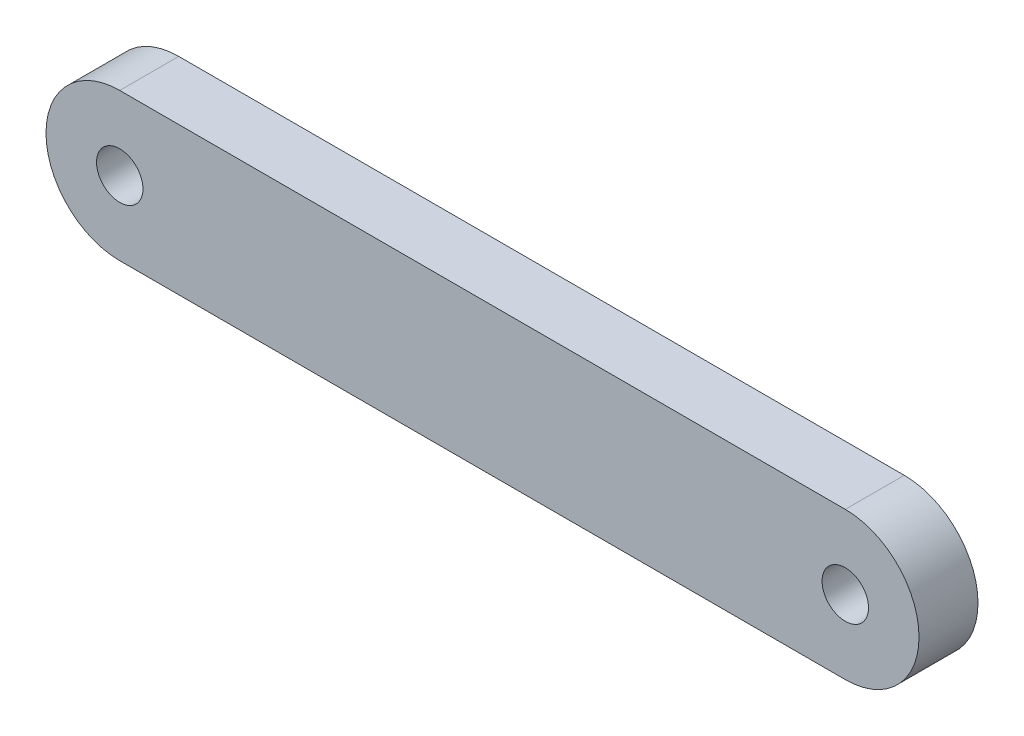
ISO-10303-21;
HEADER;
FILE_DESCRIPTION(('STEP AP214'),'2;1');
FILE_NAME('part.step','',(''),(''),'','','');
FILE_SCHEMA(('AUTOMOTIVE_DESIGN { 1 0 10303 214 1 1 1 1 }'));
ENDSEC;
DATA;
#1=APPLICATION_CONTEXT('core data for automotive mechanical design processes');
#2=APPLICATION_PROTOCOL_DEFINITION('international standard','automotive_design',2000,#1);
#3=PRODUCT_CONTEXT('',#1,'mechanical');
#4=PRODUCT('Part','Part','',(#3));
#5=PRODUCT_RELATED_PRODUCT_CATEGORY('part','',(#4));
#6=PRODUCT_DEFINITION_FORMATION('','',#4);
#7=PRODUCT_DEFINITION_CONTEXT('part definition',#1,'design');
#8=PRODUCT_DEFINITION('design','',#6,#7);
#9=PRODUCT_DEFINITION_SHAPE('','',#8);
#10=(LENGTH_UNIT() NAMED_UNIT(*) SI_UNIT(.MILLI.,.METRE.));
#11=(NAMED_UNIT(*) PLANE_ANGLE_UNIT() SI_UNIT($,.RADIAN.));
#12=(NAMED_UNIT(*) SI_UNIT($,.STERADIAN.) SOLID_ANGLE_UNIT());
#13=UNCERTAINTY_MEASURE_WITH_UNIT(LENGTH_MEASURE(1.E-05),#10,'distance_accuracy_value','');
#14=(GEOMETRIC_REPRESENTATION_CONTEXT(3) GLOBAL_UNCERTAINTY_ASSIGNED_CONTEXT((#13)) GLOBAL_UNIT_ASSIGNED_CONTEXT((#10,
#11,#12)) REPRESENTATION_CONTEXT('',''));
#15=CARTESIAN_POINT('',(0.,0.,0.));
#16=DIRECTION('',(0.,0.,1.));
#17=DIRECTION('',(1.,0.,0.));
#18=AXIS2_PLACEMENT_3D('',#15,#16,#17);
#19=CARTESIAN_POINT('',(0.,0.,5.08));
#20=DIRECTION('',(0.,0.,1.));
#21=DIRECTION('',(1.,0.,0.));
#22=AXIS2_PLACEMENT_3D('',#19,#20,#21);
#23=PLANE('',#22);
#24=CARTESIAN_POINT('',(0.,0.,5.08));
#25=DIRECTION('',(0.,0.,1.));
#26=DIRECTION('',(1.,0.,0.));
#27=AXIS2_PLACEMENT_3D('',#24,#25,#26);
#28=CIRCLE('',#27,2.);
#29=CARTESIAN_POINT('',(2.,0.,5.08));
#30=VERTEX_POINT('',#29);
#31=EDGE_CURVE('E100',#30,#30,#28,.T.);
#32=ORIENTED_EDGE('',*,*,#31,.F.);
#33=EDGE_LOOP('',(#32));
#34=FACE_BOUND('',#33,.T.);
#35=CARTESIAN_POINT('',(0.,0.,5.08));
#36=DIRECTION('',(0.,0.,1.));
#37=DIRECTION('',(1.,0.,0.));
#38=AXIS2_PLACEMENT_3D('',#35,#36,#37);
#39=CIRCLE('',#38,6.35);
#40=CARTESIAN_POINT('',(0.,6.35,5.08));
#41=VERTEX_POINT('',#40);
#42=CARTESIAN_POINT('',(0.,-6.35,5.08));
#43=VERTEX_POINT('',#42);
#44=EDGE_CURVE('E85',#41,#43,#39,.T.);
#45=ORIENTED_EDGE('',*,*,#44,.T.);
#46=DIRECTION('',(1.,0.,0.));
#47=VECTOR('',#46,1.);
#48=CARTESIAN_POINT('',(0.,-6.35,5.08));
#49=LINE('',#48,#47);
#50=CARTESIAN_POINT('',(62.484,-6.35,5.08));
#51=VERTEX_POINT('',#50);
#52=EDGE_CURVE('E80',#43,#51,#49,.T.);
#53=ORIENTED_EDGE('',*,*,#52,.T.);
#54=CARTESIAN_POINT('',(62.484,0.,5.08));
#55=DIRECTION('',(0.,0.,1.));
#56=DIRECTION('',(1.,0.,0.));
#57=AXIS2_PLACEMENT_3D('',#54,#55,#56);
#58=CIRCLE('',#57,6.35);
#59=CARTESIAN_POINT('',(62.484,6.35,5.08));
#60=VERTEX_POINT('',#59);
#61=EDGE_CURVE('E83',#51,#60,#58,.T.);
#62=ORIENTED_EDGE('',*,*,#61,.T.);
#63=DIRECTION('',(-1.,0.,0.));
#64=VECTOR('',#63,1.);
#65=CARTESIAN_POINT('',(0.,6.35,5.08));
#66=LINE('',#65,#64);
#67=EDGE_CURVE('E50',#60,#41,#66,.T.);
#68=ORIENTED_EDGE('',*,*,#67,.T.);
#69=EDGE_LOOP('',(#45,#53,#62,#68));
#70=FACE_BOUND('',#69,.T.);
#71=CARTESIAN_POINT('',(62.484,0.,5.08));
#72=DIRECTION('',(0.,0.,1.));
#73=DIRECTION('',(1.,0.,0.));
#74=AXIS2_PLACEMENT_3D('',#71,#72,#73);
#75=CIRCLE('',#74,2.);
#76=CARTESIAN_POINT('',(64.484,0.,5.08));
#77=VERTEX_POINT('',#76);
#78=EDGE_CURVE('E115',#77,#77,#75,.T.);
#79=ORIENTED_EDGE('',*,*,#78,.F.);
#80=EDGE_LOOP('',(#79));
#81=FACE_BOUND('',#80,.T.);
#82=ADVANCED_FACE('F33',(#34,#70,#81),#23,.T.);
#83=CARTESIAN_POINT('',(0.,0.,0.));
#84=DIRECTION('',(0.,0.,1.));
#85=DIRECTION('',(1.,0.,0.));
#86=AXIS2_PLACEMENT_3D('',#83,#84,#85);
#87=PLANE('',#86);
#88=CARTESIAN_POINT('',(0.,0.,0.));
#89=DIRECTION('',(0.,0.,1.));
#90=DIRECTION('',(1.,0.,0.));
#91=AXIS2_PLACEMENT_3D('',#88,#89,#90);
#92=CIRCLE('',#91,2.);
#93=CARTESIAN_POINT('',(2.,0.,0.));
#94=VERTEX_POINT('',#93);
#95=EDGE_CURVE('E112',#94,#94,#92,.T.);
#96=ORIENTED_EDGE('',*,*,#95,.T.);
#97=EDGE_LOOP('',(#96));
#98=FACE_BOUND('',#97,.T.);
#99=CARTESIAN_POINT('',(0.,0.,0.));
#100=DIRECTION('',(0.,0.,1.));
#101=DIRECTION('',(1.,0.,0.));
#102=AXIS2_PLACEMENT_3D('',#99,#100,#101);
#103=CIRCLE('',#102,6.35);
#104=CARTESIAN_POINT('',(0.,6.35,0.));
#105=VERTEX_POINT('',#104);
#106=CARTESIAN_POINT('',(0.,-6.35,0.));
#107=VERTEX_POINT('',#106);
#108=EDGE_CURVE('E97',#105,#107,#103,.T.);
#109=ORIENTED_EDGE('',*,*,#108,.F.);
#110=DIRECTION('',(-1.,0.,0.));
#111=VECTOR('',#110,1.);
#112=CARTESIAN_POINT('',(0.,6.35,0.));
#113=LINE('',#112,#111);
#114=CARTESIAN_POINT('',(62.484,6.35,0.));
#115=VERTEX_POINT('',#114);
#116=EDGE_CURVE('E73',#115,#105,#113,.T.);
#117=ORIENTED_EDGE('',*,*,#116,.F.);
#118=CARTESIAN_POINT('',(62.484,0.,0.));
#119=DIRECTION('',(0.,0.,1.));
#120=DIRECTION('',(1.,0.,0.));
#121=AXIS2_PLACEMENT_3D('',#118,#119,#120);
#122=CIRCLE('',#121,6.35);
#123=CARTESIAN_POINT('',(62.484,-6.35,0.));
#124=VERTEX_POINT('',#123);
#125=EDGE_CURVE('E67',#124,#115,#122,.T.);
#126=ORIENTED_EDGE('',*,*,#125,.F.);
#127=DIRECTION('',(1.,0.,0.));
#128=VECTOR('',#127,1.);
#129=CARTESIAN_POINT('',(0.,-6.35,0.));
#130=LINE('',#129,#128);
#131=EDGE_CURVE('E89',#107,#124,#130,.T.);
#132=ORIENTED_EDGE('',*,*,#131,.F.);
#133=EDGE_LOOP('',(#109,#117,#126,#132));
#134=FACE_BOUND('',#133,.T.);
#135=CARTESIAN_POINT('',(62.484,0.,0.));
#136=DIRECTION('',(0.,0.,1.));
#137=DIRECTION('',(1.,0.,0.));
#138=AXIS2_PLACEMENT_3D('',#135,#136,#137);
#139=CIRCLE('',#138,2.);
#140=CARTESIAN_POINT('',(64.484,0.,0.));
#141=VERTEX_POINT('',#140);
#142=EDGE_CURVE('E118',#141,#141,#139,.T.);
#143=ORIENTED_EDGE('',*,*,#142,.T.);
#144=EDGE_LOOP('',(#143));
#145=FACE_BOUND('',#144,.T.);
#146=ADVANCED_FACE('F108',(#98,#134,#145),#87,.F.);
#147=CARTESIAN_POINT('',(0.,0.,5.08));
#148=DIRECTION('',(0.,0.,-1.));
#149=DIRECTION('',(-1.,0.,0.));
#150=AXIS2_PLACEMENT_3D('',#147,#148,#149);
#151=CYLINDRICAL_SURFACE('',#150,6.35);
#152=ORIENTED_EDGE('',*,*,#108,.T.);
#153=DIRECTION('',(0.,0.,-1.));
#154=VECTOR('',#153,1.);
#155=CARTESIAN_POINT('',(0.,-6.35,5.08));
#156=LINE('',#155,#154);
#157=EDGE_CURVE('E11',#43,#107,#156,.T.);
#158=ORIENTED_EDGE('',*,*,#157,.F.);
#159=ORIENTED_EDGE('',*,*,#44,.F.);
#160=DIRECTION('',(0.,0.,-1.));
#161=VECTOR('',#160,1.);
#162=CARTESIAN_POINT('',(0.,6.35,5.08));
#163=LINE('',#162,#161);
#164=EDGE_CURVE('E93',#41,#105,#163,.T.);
#165=ORIENTED_EDGE('',*,*,#164,.T.);
#166=EDGE_LOOP('',(#152,#158,#159,#165));
#167=FACE_BOUND('',#166,.T.);
#168=ADVANCED_FACE('F35',(#167),#151,.T.);
#169=CARTESIAN_POINT('',(0.,-6.35,5.08));
#170=DIRECTION('',(0.,1.,0.));
#171=DIRECTION('',(0.,0.,1.));
#172=AXIS2_PLACEMENT_3D('',#169,#170,#171);
#173=PLANE('',#172);
#174=ORIENTED_EDGE('',*,*,#131,.T.);
#175=DIRECTION('',(0.,0.,-1.));
#176=VECTOR('',#175,1.);
#177=CARTESIAN_POINT('',(62.484,-6.35,5.08));
#178=LINE('',#177,#176);
#179=EDGE_CURVE('E42',#51,#124,#178,.T.);
#180=ORIENTED_EDGE('',*,*,#179,.F.);
#181=ORIENTED_EDGE('',*,*,#52,.F.);
#182=ORIENTED_EDGE('',*,*,#157,.T.);
#183=EDGE_LOOP('',(#174,#180,#181,#182));
#184=FACE_BOUND('',#183,.T.);
#185=ADVANCED_FACE('F88',(#184),#173,.F.);
#186=CARTESIAN_POINT('',(62.484,0.,5.08));
#187=DIRECTION('',(0.,0.,-1.));
#188=DIRECTION('',(-1.,0.,0.));
#189=AXIS2_PLACEMENT_3D('',#186,#187,#188);
#190=CYLINDRICAL_SURFACE('',#189,6.35);
#191=ORIENTED_EDGE('',*,*,#125,.T.);
#192=DIRECTION('',(0.,0.,-1.));
#193=VECTOR('',#192,1.);
#194=CARTESIAN_POINT('',(62.484,6.35,5.08));
#195=LINE('',#194,#193);
#196=EDGE_CURVE('E90',#60,#115,#195,.T.);
#197=ORIENTED_EDGE('',*,*,#196,.F.);
#198=ORIENTED_EDGE('',*,*,#61,.F.);
#199=ORIENTED_EDGE('',*,*,#179,.T.);
#200=EDGE_LOOP('',(#191,#197,#198,#199));
#201=FACE_BOUND('',#200,.T.);
#202=ADVANCED_FACE('F91',(#201),#190,.T.);
#203=CARTESIAN_POINT('',(0.,6.35,5.08));
#204=DIRECTION('',(0.,-1.,0.));
#205=DIRECTION('',(0.,0.,-1.));
#206=AXIS2_PLACEMENT_3D('',#203,#204,#205);
#207=PLANE('',#206);
#208=ORIENTED_EDGE('',*,*,#116,.T.);
#209=ORIENTED_EDGE('',*,*,#164,.F.);
#210=ORIENTED_EDGE('',*,*,#67,.F.);
#211=ORIENTED_EDGE('',*,*,#196,.T.);
#212=EDGE_LOOP('',(#208,#209,#210,#211));
#213=FACE_BOUND('',#212,.T.);
#214=ADVANCED_FACE('F105',(#213),#207,.F.);
#215=CARTESIAN_POINT('',(0.,0.,5.08));
#216=DIRECTION('',(0.,0.,-1.));
#217=DIRECTION('',(-1.,0.,0.));
#218=AXIS2_PLACEMENT_3D('',#215,#216,#217);
#219=CYLINDRICAL_SURFACE('',#218,2.);
#220=ORIENTED_EDGE('',*,*,#31,.T.);
#221=EDGE_LOOP('',(#220));
#222=FACE_BOUND('',#221,.T.);
#223=ORIENTED_EDGE('',*,*,#95,.F.);
#224=EDGE_LOOP('',(#223));
#225=FACE_BOUND('',#224,.T.);
#226=ADVANCED_FACE('F136',(#222,#225),#219,.F.);
#227=CARTESIAN_POINT('',(62.484,0.,5.08));
#228=DIRECTION('',(0.,0.,-1.));
#229=DIRECTION('',(-1.,0.,0.));
#230=AXIS2_PLACEMENT_3D('',#227,#228,#229);
#231=CYLINDRICAL_SURFACE('',#230,2.);
#232=ORIENTED_EDGE('',*,*,#78,.T.);
#233=EDGE_LOOP('',(#232));
#234=FACE_BOUND('',#233,.T.);
#235=ORIENTED_EDGE('',*,*,#142,.F.);
#236=EDGE_LOOP('',(#235));
#237=FACE_BOUND('',#236,.T.);
#238=ADVANCED_FACE('F124',(#234,#237),#231,.F.);
#239=CLOSED_SHELL('',(#82,#146,#168,#185,#202,#214,#226,#238));
#240=MANIFOLD_SOLID_BREP('B2',#239);
#241=ADVANCED_BREP_SHAPE_REPRESENTATION('',(#18,#240),#14);
#242=SHAPE_DEFINITION_REPRESENTATION(#9,#241);
ENDSEC;
END-ISO-10303-21;
